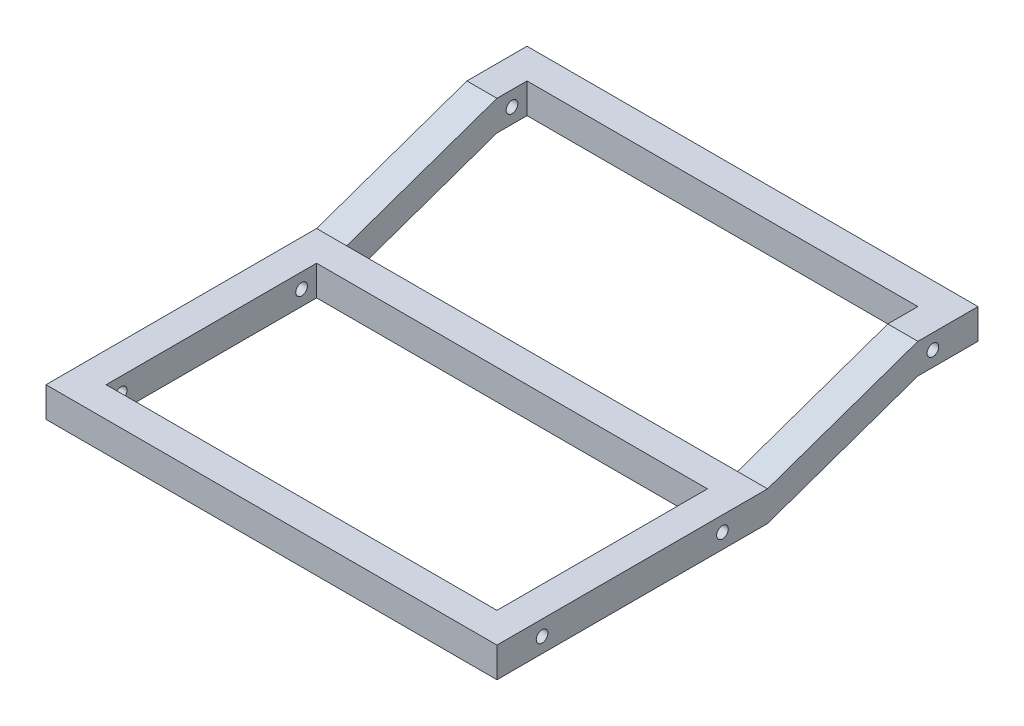
ISO-10303-21;
HEADER;
FILE_DESCRIPTION(('STEP AP214'),'2;1');
FILE_NAME('part.step','',(''),(''),'','','');
FILE_SCHEMA(('AUTOMOTIVE_DESIGN { 1 0 10303 214 1 1 1 1 }'));
ENDSEC;
DATA;
#1=APPLICATION_CONTEXT('core data for automotive mechanical design processes');
#2=APPLICATION_PROTOCOL_DEFINITION('international standard','automotive_design',2000,#1);
#3=PRODUCT_CONTEXT('',#1,'mechanical');
#4=PRODUCT('Part','Part','',(#3));
#5=PRODUCT_RELATED_PRODUCT_CATEGORY('part','',(#4));
#6=PRODUCT_DEFINITION_FORMATION('','',#4);
#7=PRODUCT_DEFINITION_CONTEXT('part definition',#1,'design');
#8=PRODUCT_DEFINITION('design','',#6,#7);
#9=PRODUCT_DEFINITION_SHAPE('','',#8);
#10=(LENGTH_UNIT() NAMED_UNIT(*) SI_UNIT(.MILLI.,.METRE.));
#11=(NAMED_UNIT(*) PLANE_ANGLE_UNIT() SI_UNIT($,.RADIAN.));
#12=(NAMED_UNIT(*) SI_UNIT($,.STERADIAN.) SOLID_ANGLE_UNIT());
#13=UNCERTAINTY_MEASURE_WITH_UNIT(LENGTH_MEASURE(1.E-05),#10,'distance_accuracy_value','');
#14=(GEOMETRIC_REPRESENTATION_CONTEXT(3) GLOBAL_UNCERTAINTY_ASSIGNED_CONTEXT((#13)) GLOBAL_UNIT_ASSIGNED_CONTEXT((#10,
#11,#12)) REPRESENTATION_CONTEXT('',''));
#15=CARTESIAN_POINT('',(0.,0.,0.));
#16=DIRECTION('',(0.,0.,1.));
#17=DIRECTION('',(1.,0.,0.));
#18=AXIS2_PLACEMENT_3D('',#15,#16,#17);
#19=CARTESIAN_POINT('',(0.,8.,-57.2536373614485));
#20=DIRECTION('',(0.,0.,-1.));
#21=DIRECTION('',(-1.,0.,0.));
#22=AXIS2_PLACEMENT_3D('',#19,#20,#21);
#23=PLANE('',#22);
#24=DIRECTION('',(1.,0.,0.));
#25=VECTOR('',#24,1.);
#26=CARTESIAN_POINT('',(0.,8.,-57.2536373614485));
#27=LINE('',#26,#25);
#28=CARTESIAN_POINT('',(-2.55507755048383,8.,-57.2536373614485));
#29=VERTEX_POINT('',#28);
#30=CARTESIAN_POINT('',(101.444922449516,8.,-57.2536373614485));
#31=VERTEX_POINT('',#30);
#32=EDGE_CURVE('E262',#29,#31,#27,.T.);
#33=ORIENTED_EDGE('',*,*,#32,.T.);
#34=DIRECTION('',(0.,1.,0.));
#35=VECTOR('',#34,1.);
#36=CARTESIAN_POINT('',(101.444922449516,0.,-57.2536373614485));
#37=LINE('',#36,#35);
#38=CARTESIAN_POINT('',(101.444922449516,0.,-57.2536373614485));
#39=VERTEX_POINT('',#38);
#40=EDGE_CURVE('E174',#39,#31,#37,.T.);
#41=ORIENTED_EDGE('',*,*,#40,.F.);
#42=DIRECTION('',(1.,0.,0.));
#43=VECTOR('',#42,1.);
#44=CARTESIAN_POINT('',(0.,0.,-57.2536373614485));
#45=LINE('',#44,#43);
#46=CARTESIAN_POINT('',(-2.55507755048383,0.,-57.2536373614485));
#47=VERTEX_POINT('',#46);
#48=EDGE_CURVE('E286',#47,#39,#45,.T.);
#49=ORIENTED_EDGE('',*,*,#48,.F.);
#50=DIRECTION('',(0.,-1.,0.));
#51=VECTOR('',#50,1.);
#52=CARTESIAN_POINT('',(-2.55507755048383,0.,-57.2536373614485));
#53=LINE('',#52,#51);
#54=EDGE_CURVE('E230',#29,#47,#53,.T.);
#55=ORIENTED_EDGE('',*,*,#54,.F.);
#56=EDGE_LOOP('',(#33,#41,#49,#55));
#57=FACE_BOUND('',#56,.T.);
#58=ADVANCED_FACE('F41',(#57),#23,.T.);
#59=CARTESIAN_POINT('',(107.444922449516,22.,-105.253637361449));
#60=DIRECTION('',(0.,0.,-1.));
#61=DIRECTION('',(-1.,0.,0.));
#62=AXIS2_PLACEMENT_3D('',#59,#60,#61);
#63=PLANE('',#62);
#64=DIRECTION('',(0.,-1.,0.));
#65=VECTOR('',#64,1.);
#66=CARTESIAN_POINT('',(101.444922449516,22.,-105.253637361449));
#67=LINE('',#66,#65);
#68=CARTESIAN_POINT('',(101.444922449516,22.,-105.253637361449));
#69=VERTEX_POINT('',#68);
#70=CARTESIAN_POINT('',(101.444922449516,14.,-105.253637361449));
#71=VERTEX_POINT('',#70);
#72=EDGE_CURVE('E11',#69,#71,#67,.T.);
#73=ORIENTED_EDGE('',*,*,#72,.F.);
#74=DIRECTION('',(-1.,0.,0.));
#75=VECTOR('',#74,1.);
#76=CARTESIAN_POINT('',(107.444922449516,22.,-105.253637361449));
#77=LINE('',#76,#75);
#78=CARTESIAN_POINT('',(-2.55507755048387,22.,-105.253637361449));
#79=VERTEX_POINT('',#78);
#80=EDGE_CURVE('E215',#69,#79,#77,.T.);
#81=ORIENTED_EDGE('',*,*,#80,.T.);
#82=DIRECTION('',(0.,-1.,0.));
#83=VECTOR('',#82,1.);
#84=CARTESIAN_POINT('',(-2.55507755048387,22.,-105.253637361449));
#85=LINE('',#84,#83);
#86=CARTESIAN_POINT('',(-2.55507755048387,14.,-105.253637361449));
#87=VERTEX_POINT('',#86);
#88=EDGE_CURVE('E208',#79,#87,#85,.T.);
#89=ORIENTED_EDGE('',*,*,#88,.T.);
#90=DIRECTION('',(-1.,0.,0.));
#91=VECTOR('',#90,1.);
#92=CARTESIAN_POINT('',(107.444922449516,14.,-105.253637361449));
#93=LINE('',#92,#91);
#94=EDGE_CURVE('E61',#71,#87,#93,.T.);
#95=ORIENTED_EDGE('',*,*,#94,.F.);
#96=EDGE_LOOP('',(#73,#81,#89,#95));
#97=FACE_BOUND('',#96,.T.);
#98=ADVANCED_FACE('F385',(#97),#63,.F.);
#99=CARTESIAN_POINT('',(-2.55507755048378,0.,0.));
#100=DIRECTION('',(-1.,0.,0.));
#101=DIRECTION('',(0.,0.,1.));
#102=AXIS2_PLACEMENT_3D('',#99,#100,#101);
#103=PLANE('',#102);
#104=CARTESIAN_POINT('',(-2.55507755048387,18.,-101.253637361449));
#105=DIRECTION('',(-1.,0.,0.));
#106=DIRECTION('',(0.,0.,1.));
#107=AXIS2_PLACEMENT_3D('',#104,#105,#106);
#108=CIRCLE('',#107,1.54999999999999);
#109=CARTESIAN_POINT('',(-2.55507755048387,18.,-99.7036373614485));
#110=VERTEX_POINT('',#109);
#111=EDGE_CURVE('E321',#110,#110,#108,.T.);
#112=ORIENTED_EDGE('',*,*,#111,.T.);
#113=EDGE_LOOP('',(#112));
#114=FACE_BOUND('',#113,.T.);
#115=ORIENTED_EDGE('',*,*,#88,.F.);
#116=DIRECTION('',(0.,0.,-1.));
#117=VECTOR('',#116,1.);
#118=CARTESIAN_POINT('',(-2.55507755048378,22.,0.));
#119=LINE('',#118,#117);
#120=CARTESIAN_POINT('',(-2.55507755048387,22.,-97.2536373614485));
#121=VERTEX_POINT('',#120);
#122=EDGE_CURVE('E221',#121,#79,#119,.T.);
#123=ORIENTED_EDGE('',*,*,#122,.F.);
#124=DIRECTION('',(0.,0.330350424728106,-0.943858356366017));
#125=VECTOR('',#124,1.);
#126=CARTESIAN_POINT('',(-2.55507755048378,-10.7249648788481,-3.75373770759683));
#127=LINE('',#126,#125);
#128=EDGE_CURVE('E218',#29,#121,#127,.T.);
#129=ORIENTED_EDGE('',*,*,#128,.F.);
#130=ORIENTED_EDGE('',*,*,#54,.T.);
#131=DIRECTION('',(0.,0.330350424728106,-0.943858356366017));
#132=VECTOR('',#131,1.);
#133=CARTESIAN_POINT('',(-2.55507755048379,-17.8519136539038,-6.24816977886632));
#134=LINE('',#133,#132);
#135=CARTESIAN_POINT('',(-2.55507755048387,14.,-97.2536373614485));
#136=VERTEX_POINT('',#135);
#137=EDGE_CURVE('E228',#47,#136,#134,.T.);
#138=ORIENTED_EDGE('',*,*,#137,.T.);
#139=DIRECTION('',(0.,0.,-1.));
#140=VECTOR('',#139,1.);
#141=CARTESIAN_POINT('',(-2.55507755048378,14.,0.));
#142=LINE('',#141,#140);
#143=EDGE_CURVE('E225',#136,#87,#142,.T.);
#144=ORIENTED_EDGE('',*,*,#143,.T.);
#145=EDGE_LOOP('',(#115,#123,#129,#130,#138,#144));
#146=FACE_BOUND('',#145,.T.);
#147=ADVANCED_FACE('F381',(#114,#146),#103,.F.);
#148=CARTESIAN_POINT('',(0.,8.,-49.2536373614485));
#149=DIRECTION('',(0.,0.,-1.));
#150=DIRECTION('',(-1.,0.,0.));
#151=AXIS2_PLACEMENT_3D('',#148,#149,#150);
#152=PLANE('',#151);
#153=DIRECTION('',(1.,0.,0.));
#154=VECTOR('',#153,1.);
#155=CARTESIAN_POINT('',(0.,0.,-49.2536373614485));
#156=LINE('',#155,#154);
#157=CARTESIAN_POINT('',(-2.55507755048383,0.,-49.2536373614485));
#158=VERTEX_POINT('',#157);
#159=CARTESIAN_POINT('',(101.444922449516,0.,-49.2536373614485));
#160=VERTEX_POINT('',#159);
#161=EDGE_CURVE('E291',#158,#160,#156,.T.);
#162=ORIENTED_EDGE('',*,*,#161,.T.);
#163=DIRECTION('',(0.,-1.,0.));
#164=VECTOR('',#163,1.);
#165=CARTESIAN_POINT('',(101.444922449516,8.,-49.2536373614485));
#166=LINE('',#165,#164);
#167=CARTESIAN_POINT('',(101.444922449516,8.,-49.2536373614485));
#168=VERTEX_POINT('',#167);
#169=EDGE_CURVE('E50',#168,#160,#166,.T.);
#170=ORIENTED_EDGE('',*,*,#169,.F.);
#171=DIRECTION('',(1.,0.,0.));
#172=VECTOR('',#171,1.);
#173=CARTESIAN_POINT('',(0.,8.,-49.2536373614485));
#174=LINE('',#173,#172);
#175=CARTESIAN_POINT('',(-2.55507755048383,8.,-49.2536373614485));
#176=VERTEX_POINT('',#175);
#177=EDGE_CURVE('E269',#176,#168,#174,.T.);
#178=ORIENTED_EDGE('',*,*,#177,.F.);
#179=DIRECTION('',(0.,-1.,0.));
#180=VECTOR('',#179,1.);
#181=CARTESIAN_POINT('',(-2.55507755048383,8.,-49.2536373614485));
#182=LINE('',#181,#180);
#183=EDGE_CURVE('E302',#176,#158,#182,.T.);
#184=ORIENTED_EDGE('',*,*,#183,.T.);
#185=EDGE_LOOP('',(#162,#170,#178,#184));
#186=FACE_BOUND('',#185,.T.);
#187=ADVANCED_FACE('F362',(#186),#152,.F.);
#188=CARTESIAN_POINT('',(101.444922449516,8.,0.));
#189=DIRECTION('',(1.,0.,0.));
#190=DIRECTION('',(0.,0.,-1.));
#191=AXIS2_PLACEMENT_3D('',#188,#189,#190);
#192=PLANE('',#191);
#193=CARTESIAN_POINT('',(101.444922449516,4.,2.74636263855138));
#194=DIRECTION('',(1.,0.,0.));
#195=DIRECTION('',(0.,0.,-1.));
#196=AXIS2_PLACEMENT_3D('',#193,#194,#195);
#197=CIRCLE('',#196,1.55);
#198=CARTESIAN_POINT('',(101.444922449516,4.,1.19636263855138));
#199=VERTEX_POINT('',#198);
#200=EDGE_CURVE('E192',#199,#199,#197,.T.);
#201=ORIENTED_EDGE('',*,*,#200,.T.);
#202=EDGE_LOOP('',(#201));
#203=FACE_BOUND('',#202,.T.);
#204=CARTESIAN_POINT('',(101.444922449516,4.,-45.2536373614486));
#205=DIRECTION('',(1.,0.,0.));
#206=DIRECTION('',(0.,0.,-1.));
#207=AXIS2_PLACEMENT_3D('',#204,#205,#206);
#208=CIRCLE('',#207,1.55);
#209=CARTESIAN_POINT('',(101.444922449516,4.,-46.8036373614486));
#210=VERTEX_POINT('',#209);
#211=EDGE_CURVE('E325',#210,#210,#208,.T.);
#212=ORIENTED_EDGE('',*,*,#211,.T.);
#213=EDGE_LOOP('',(#212));
#214=FACE_BOUND('',#213,.T.);
#215=DIRECTION('',(0.,0.,1.));
#216=VECTOR('',#215,1.);
#217=CARTESIAN_POINT('',(101.444922449516,0.,0.));
#218=LINE('',#217,#216);
#219=CARTESIAN_POINT('',(101.444922449516,0.,6.74636263855148));
#220=VERTEX_POINT('',#219);
#221=EDGE_CURVE('E294',#160,#220,#218,.T.);
#222=ORIENTED_EDGE('',*,*,#221,.T.);
#223=DIRECTION('',(0.,-1.,0.));
#224=VECTOR('',#223,1.);
#225=CARTESIAN_POINT('',(101.444922449516,8.,6.74636263855148));
#226=LINE('',#225,#224);
#227=CARTESIAN_POINT('',(101.444922449516,8.,6.74636263855148));
#228=VERTEX_POINT('',#227);
#229=EDGE_CURVE('E307',#228,#220,#226,.T.);
#230=ORIENTED_EDGE('',*,*,#229,.F.);
#231=DIRECTION('',(0.,0.,1.));
#232=VECTOR('',#231,1.);
#233=CARTESIAN_POINT('',(101.444922449516,8.,0.));
#234=LINE('',#233,#232);
#235=EDGE_CURVE('E272',#168,#228,#234,.T.);
#236=ORIENTED_EDGE('',*,*,#235,.F.);
#237=ORIENTED_EDGE('',*,*,#169,.T.);
#238=EDGE_LOOP('',(#222,#230,#236,#237));
#239=FACE_BOUND('',#238,.T.);
#240=ADVANCED_FACE('F370',(#203,#214,#239),#192,.F.);
#241=CARTESIAN_POINT('',(0.,8.,6.74636263855148));
#242=DIRECTION('',(0.,0.,-1.));
#243=DIRECTION('',(-1.,0.,0.));
#244=AXIS2_PLACEMENT_3D('',#241,#242,#243);
#245=PLANE('',#244);
#246=DIRECTION('',(1.,0.,0.));
#247=VECTOR('',#246,1.);
#248=CARTESIAN_POINT('',(0.,0.,6.74636263855148));
#249=LINE('',#248,#247);
#250=CARTESIAN_POINT('',(-2.55507755048382,0.,6.74636263855148));
#251=VERTEX_POINT('',#250);
#252=EDGE_CURVE('E297',#251,#220,#249,.T.);
#253=ORIENTED_EDGE('',*,*,#252,.F.);
#254=DIRECTION('',(0.,-1.,0.));
#255=VECTOR('',#254,1.);
#256=CARTESIAN_POINT('',(-2.55507755048382,8.,6.74636263855148));
#257=LINE('',#256,#255);
#258=CARTESIAN_POINT('',(-2.55507755048382,8.,6.74636263855148));
#259=VERTEX_POINT('',#258);
#260=EDGE_CURVE('E304',#259,#251,#257,.T.);
#261=ORIENTED_EDGE('',*,*,#260,.F.);
#262=DIRECTION('',(1.,0.,0.));
#263=VECTOR('',#262,1.);
#264=CARTESIAN_POINT('',(0.,8.,6.74636263855148));
#265=LINE('',#264,#263);
#266=EDGE_CURVE('E274',#259,#228,#265,.T.);
#267=ORIENTED_EDGE('',*,*,#266,.T.);
#268=ORIENTED_EDGE('',*,*,#229,.T.);
#269=EDGE_LOOP('',(#253,#261,#267,#268));
#270=FACE_BOUND('',#269,.T.);
#271=ADVANCED_FACE('F368',(#270),#245,.T.);
#272=CARTESIAN_POINT('',(0.,8.,14.7463626385515));
#273=DIRECTION('',(0.,0.,-1.));
#274=DIRECTION('',(-1.,0.,0.));
#275=AXIS2_PLACEMENT_3D('',#272,#273,#274);
#276=PLANE('',#275);
#277=DIRECTION('',(1.,0.,0.));
#278=VECTOR('',#277,1.);
#279=CARTESIAN_POINT('',(0.,0.,14.7463626385515));
#280=LINE('',#279,#278);
#281=CARTESIAN_POINT('',(-10.5550775504838,0.,14.7463626385515));
#282=VERTEX_POINT('',#281);
#283=CARTESIAN_POINT('',(109.444922449516,0.,14.7463626385515));
#284=VERTEX_POINT('',#283);
#285=EDGE_CURVE('E249',#282,#284,#280,.T.);
#286=ORIENTED_EDGE('',*,*,#285,.T.);
#287=DIRECTION('',(0.,-1.,0.));
#288=VECTOR('',#287,1.);
#289=CARTESIAN_POINT('',(109.444922449516,8.,14.7463626385515));
#290=LINE('',#289,#288);
#291=CARTESIAN_POINT('',(109.444922449516,8.,14.7463626385515));
#292=VERTEX_POINT('',#291);
#293=EDGE_CURVE('E305',#292,#284,#290,.T.);
#294=ORIENTED_EDGE('',*,*,#293,.F.);
#295=DIRECTION('',(1.,0.,0.));
#296=VECTOR('',#295,1.);
#297=CARTESIAN_POINT('',(0.,8.,14.7463626385515));
#298=LINE('',#297,#296);
#299=CARTESIAN_POINT('',(-10.5550775504838,8.,14.7463626385515));
#300=VERTEX_POINT('',#299);
#301=EDGE_CURVE('E255',#300,#292,#298,.T.);
#302=ORIENTED_EDGE('',*,*,#301,.F.);
#303=DIRECTION('',(0.,-1.,0.));
#304=VECTOR('',#303,1.);
#305=CARTESIAN_POINT('',(-10.5550775504838,8.,14.7463626385515));
#306=LINE('',#305,#304);
#307=EDGE_CURVE('E280',#300,#282,#306,.T.);
#308=ORIENTED_EDGE('',*,*,#307,.T.);
#309=EDGE_LOOP('',(#286,#294,#302,#308));
#310=FACE_BOUND('',#309,.T.);
#311=ADVANCED_FACE('F43',(#310),#276,.F.);
#312=CARTESIAN_POINT('',(109.444922449516,8.,1.89856676299637E-13));
#313=DIRECTION('',(-1.,0.,0.));
#314=DIRECTION('',(0.,0.,1.));
#315=AXIS2_PLACEMENT_3D('',#312,#313,#314);
#316=PLANE('',#315);
#317=CARTESIAN_POINT('',(109.444922449516,4.,2.74636263855138));
#318=DIRECTION('',(-1.,0.,0.));
#319=DIRECTION('',(0.,0.,1.));
#320=AXIS2_PLACEMENT_3D('',#317,#318,#319);
#321=CIRCLE('',#320,1.55);
#322=CARTESIAN_POINT('',(109.444922449516,4.,4.29636263855138));
#323=VERTEX_POINT('',#322);
#324=EDGE_CURVE('E336',#323,#323,#321,.T.);
#325=ORIENTED_EDGE('',*,*,#324,.T.);
#326=EDGE_LOOP('',(#325));
#327=FACE_BOUND('',#326,.T.);
#328=CARTESIAN_POINT('',(109.444922449516,4.,-45.2536373614486));
#329=DIRECTION('',(-1.,0.,0.));
#330=DIRECTION('',(0.,0.,1.));
#331=AXIS2_PLACEMENT_3D('',#328,#329,#330);
#332=CIRCLE('',#331,1.55);
#333=CARTESIAN_POINT('',(109.444922449516,4.,-43.7036373614486));
#334=VERTEX_POINT('',#333);
#335=EDGE_CURVE('E320',#334,#334,#332,.T.);
#336=ORIENTED_EDGE('',*,*,#335,.T.);
#337=EDGE_LOOP('',(#336));
#338=FACE_BOUND('',#337,.T.);
#339=CARTESIAN_POINT('',(109.444922449516,18.,-101.253637361449));
#340=DIRECTION('',(-1.,0.,0.));
#341=DIRECTION('',(0.,0.,1.));
#342=AXIS2_PLACEMENT_3D('',#339,#340,#341);
#343=CIRCLE('',#342,1.54999999999999);
#344=CARTESIAN_POINT('',(109.444922449516,18.,-99.7036373614486));
#345=VERTEX_POINT('',#344);
#346=EDGE_CURVE('E316',#345,#345,#343,.T.);
#347=ORIENTED_EDGE('',*,*,#346,.T.);
#348=EDGE_LOOP('',(#347));
#349=FACE_BOUND('',#348,.T.);
#350=DIRECTION('',(0.,0.,-1.));
#351=VECTOR('',#350,1.);
#352=CARTESIAN_POINT('',(109.444922449516,0.,1.89856676299637E-13));
#353=LINE('',#352,#351);
#354=CARTESIAN_POINT('',(109.444922449516,0.,-57.2536373614485));
#355=VERTEX_POINT('',#354);
#356=EDGE_CURVE('E283',#284,#355,#353,.T.);
#357=ORIENTED_EDGE('',*,*,#356,.T.);
#358=DIRECTION('',(0.,0.330350424728106,-0.943858356366018));
#359=VECTOR('',#358,1.);
#360=CARTESIAN_POINT('',(109.444922449516,-17.8519136539037,-6.2481697788663));
#361=LINE('',#360,#359);
#362=CARTESIAN_POINT('',(109.444922449516,14.,-97.2536373614483));
#363=VERTEX_POINT('',#362);
#364=EDGE_CURVE('E199',#355,#363,#361,.T.);
#365=ORIENTED_EDGE('',*,*,#364,.T.);
#366=DIRECTION('',(0.,0.,-1.));
#367=VECTOR('',#366,1.);
#368=CARTESIAN_POINT('',(109.444922449516,14.,0.));
#369=LINE('',#368,#367);
#370=CARTESIAN_POINT('',(109.444922449516,14.,-113.253637361448));
#371=VERTEX_POINT('',#370);
#372=EDGE_CURVE('E169',#363,#371,#369,.T.);
#373=ORIENTED_EDGE('',*,*,#372,.T.);
#374=DIRECTION('',(0.,-1.,0.));
#375=VECTOR('',#374,1.);
#376=CARTESIAN_POINT('',(109.444922449516,0.,-113.253637361448));
#377=LINE('',#376,#375);
#378=CARTESIAN_POINT('',(109.444922449516,22.,-113.253637361448));
#379=VERTEX_POINT('',#378);
#380=EDGE_CURVE('E202',#379,#371,#377,.T.);
#381=ORIENTED_EDGE('',*,*,#380,.F.);
#382=DIRECTION('',(0.,0.,-1.));
#383=VECTOR('',#382,1.);
#384=CARTESIAN_POINT('',(109.444922449516,22.,0.));
#385=LINE('',#384,#383);
#386=CARTESIAN_POINT('',(109.444922449516,22.,-97.2536373614483));
#387=VERTEX_POINT('',#386);
#388=EDGE_CURVE('E189',#387,#379,#385,.T.);
#389=ORIENTED_EDGE('',*,*,#388,.F.);
#390=DIRECTION('',(0.,0.330350424728106,-0.943858356366018));
#391=VECTOR('',#390,1.);
#392=CARTESIAN_POINT('',(109.444922449516,-10.724964878848,-3.75373770759681));
#393=LINE('',#392,#391);
#394=CARTESIAN_POINT('',(109.444922449516,8.,-57.2536373614485));
#395=VERTEX_POINT('',#394);
#396=EDGE_CURVE('E187',#395,#387,#393,.T.);
#397=ORIENTED_EDGE('',*,*,#396,.F.);
#398=DIRECTION('',(0.,0.,-1.));
#399=VECTOR('',#398,1.);
#400=CARTESIAN_POINT('',(109.444922449516,8.,1.89856676299637E-13));
#401=LINE('',#400,#399);
#402=EDGE_CURVE('E258',#292,#395,#401,.T.);
#403=ORIENTED_EDGE('',*,*,#402,.F.);
#404=ORIENTED_EDGE('',*,*,#293,.T.);
#405=EDGE_LOOP('',(#357,#365,#373,#381,#389,#397,#403,#404));
#406=FACE_BOUND('',#405,.T.);
#407=ADVANCED_FACE('F395',(#327,#338,#349,#406),#316,.F.);
#408=CARTESIAN_POINT('',(-10.5550775504838,8.,0.));
#409=DIRECTION('',(-1.,0.,0.));
#410=DIRECTION('',(0.,0.,1.));
#411=AXIS2_PLACEMENT_3D('',#408,#409,#410);
#412=PLANE('',#411);
#413=CARTESIAN_POINT('',(-10.5550775504838,4.,2.74636263855148));
#414=DIRECTION('',(-1.,0.,0.));
#415=DIRECTION('',(0.,0.,1.));
#416=AXIS2_PLACEMENT_3D('',#413,#414,#415);
#417=CIRCLE('',#416,1.55);
#418=CARTESIAN_POINT('',(-10.5550775504838,4.,4.29636263855148));
#419=VERTEX_POINT('',#418);
#420=EDGE_CURVE('E317',#419,#419,#417,.T.);
#421=ORIENTED_EDGE('',*,*,#420,.F.);
#422=EDGE_LOOP('',(#421));
#423=FACE_BOUND('',#422,.T.);
#424=CARTESIAN_POINT('',(-10.5550775504838,4.,-45.2536373614485));
#425=DIRECTION('',(-1.,0.,0.));
#426=DIRECTION('',(0.,0.,1.));
#427=AXIS2_PLACEMENT_3D('',#424,#425,#426);
#428=CIRCLE('',#427,1.55);
#429=CARTESIAN_POINT('',(-10.5550775504838,4.,-43.7036373614485));
#430=VERTEX_POINT('',#429);
#431=EDGE_CURVE('E724',#430,#430,#428,.T.);
#432=ORIENTED_EDGE('',*,*,#431,.F.);
#433=EDGE_LOOP('',(#432));
#434=FACE_BOUND('',#433,.T.);
#435=CARTESIAN_POINT('',(-10.5550775504839,18.,-101.253637361449));
#436=DIRECTION('',(-1.,0.,0.));
#437=DIRECTION('',(0.,0.,1.));
#438=AXIS2_PLACEMENT_3D('',#435,#436,#437);
#439=CIRCLE('',#438,1.54999999999999);
#440=CARTESIAN_POINT('',(-10.5550775504839,18.,-99.7036373614485));
#441=VERTEX_POINT('',#440);
#442=EDGE_CURVE('E726',#441,#441,#439,.T.);
#443=ORIENTED_EDGE('',*,*,#442,.F.);
#444=EDGE_LOOP('',(#443));
#445=FACE_BOUND('',#444,.T.);
#446=DIRECTION('',(0.,0.,-1.));
#447=VECTOR('',#446,1.);
#448=CARTESIAN_POINT('',(-10.5550775504838,0.,0.));
#449=LINE('',#448,#447);
#450=CARTESIAN_POINT('',(-10.5550775504838,0.,-57.2536373614485));
#451=VERTEX_POINT('',#450);
#452=EDGE_CURVE('E289',#282,#451,#449,.T.);
#453=ORIENTED_EDGE('',*,*,#452,.F.);
#454=ORIENTED_EDGE('',*,*,#307,.F.);
#455=DIRECTION('',(0.,0.,-1.));
#456=VECTOR('',#455,1.);
#457=CARTESIAN_POINT('',(-10.5550775504838,8.,0.));
#458=LINE('',#457,#456);
#459=CARTESIAN_POINT('',(-10.5550775504838,8.,-57.2536373614485));
#460=VERTEX_POINT('',#459);
#461=EDGE_CURVE('E266',#300,#460,#458,.T.);
#462=ORIENTED_EDGE('',*,*,#461,.T.);
#463=DIRECTION('',(0.,0.330350424728106,-0.943858356366017));
#464=VECTOR('',#463,1.);
#465=CARTESIAN_POINT('',(-10.5550775504838,-10.7249648788481,-3.75373770759682));
#466=LINE('',#465,#464);
#467=CARTESIAN_POINT('',(-10.5550775504839,22.,-97.2536373614485));
#468=VERTEX_POINT('',#467);
#469=EDGE_CURVE('E217',#460,#468,#466,.T.);
#470=ORIENTED_EDGE('',*,*,#469,.T.);
#471=DIRECTION('',(0.,0.,-1.));
#472=VECTOR('',#471,1.);
#473=CARTESIAN_POINT('',(-10.5550775504838,22.,0.));
#474=LINE('',#473,#472);
#475=CARTESIAN_POINT('',(-10.5550775504839,22.,-113.253637361449));
#476=VERTEX_POINT('',#475);
#477=EDGE_CURVE('E236',#468,#476,#474,.T.);
#478=ORIENTED_EDGE('',*,*,#477,.T.);
#479=DIRECTION('',(0.,1.,0.));
#480=VECTOR('',#479,1.);
#481=CARTESIAN_POINT('',(-10.5550775504839,0.,-113.253637361449));
#482=LINE('',#481,#480);
#483=CARTESIAN_POINT('',(-10.5550775504839,14.,-113.253637361449));
#484=VERTEX_POINT('',#483);
#485=EDGE_CURVE('E239',#484,#476,#482,.T.);
#486=ORIENTED_EDGE('',*,*,#485,.F.);
#487=DIRECTION('',(0.,0.,-1.));
#488=VECTOR('',#487,1.);
#489=CARTESIAN_POINT('',(-10.5550775504838,14.,0.));
#490=LINE('',#489,#488);
#491=CARTESIAN_POINT('',(-10.5550775504839,14.,-97.2536373614485));
#492=VERTEX_POINT('',#491);
#493=EDGE_CURVE('E242',#492,#484,#490,.T.);
#494=ORIENTED_EDGE('',*,*,#493,.F.);
#495=DIRECTION('',(0.,0.330350424728106,-0.943858356366017));
#496=VECTOR('',#495,1.);
#497=CARTESIAN_POINT('',(-10.5550775504838,-17.8519136539038,-6.24816977886631));
#498=LINE('',#497,#496);
#499=EDGE_CURVE('E222',#451,#492,#498,.T.);
#500=ORIENTED_EDGE('',*,*,#499,.F.);
#501=EDGE_LOOP('',(#453,#454,#462,#470,#478,#486,#494,#500));
#502=FACE_BOUND('',#501,.T.);
#503=ADVANCED_FACE('F351',(#423,#434,#445,#502),#412,.T.);
#504=CARTESIAN_POINT('',(-2.55507755048382,8.,0.));
#505=DIRECTION('',(1.,0.,0.));
#506=DIRECTION('',(0.,0.,-1.));
#507=AXIS2_PLACEMENT_3D('',#504,#505,#506);
#508=PLANE('',#507);
#509=CARTESIAN_POINT('',(-2.55507755048381,4.,2.74636263855147));
#510=DIRECTION('',(1.,0.,0.));
#511=DIRECTION('',(0.,0.,-1.));
#512=AXIS2_PLACEMENT_3D('',#509,#510,#511);
#513=CIRCLE('',#512,1.55);
#514=CARTESIAN_POINT('',(-2.55507755048381,4.,1.19636263855147));
#515=VERTEX_POINT('',#514);
#516=EDGE_CURVE('E45',#515,#515,#513,.T.);
#517=ORIENTED_EDGE('',*,*,#516,.F.);
#518=EDGE_LOOP('',(#517));
#519=FACE_BOUND('',#518,.T.);
#520=CARTESIAN_POINT('',(-2.55507755048381,4.,-45.2536373614485));
#521=DIRECTION('',(1.,0.,0.));
#522=DIRECTION('',(0.,0.,-1.));
#523=AXIS2_PLACEMENT_3D('',#520,#521,#522);
#524=CIRCLE('',#523,1.55);
#525=CARTESIAN_POINT('',(-2.55507755048381,4.,-46.8036373614485));
#526=VERTEX_POINT('',#525);
#527=EDGE_CURVE('E318',#526,#526,#524,.T.);
#528=ORIENTED_EDGE('',*,*,#527,.F.);
#529=EDGE_LOOP('',(#528));
#530=FACE_BOUND('',#529,.T.);
#531=DIRECTION('',(0.,0.,1.));
#532=VECTOR('',#531,1.);
#533=CARTESIAN_POINT('',(-2.55507755048382,0.,0.));
#534=LINE('',#533,#532);
#535=EDGE_CURVE('E259',#158,#251,#534,.T.);
#536=ORIENTED_EDGE('',*,*,#535,.F.);
#537=ORIENTED_EDGE('',*,*,#183,.F.);
#538=DIRECTION('',(0.,0.,1.));
#539=VECTOR('',#538,1.);
#540=CARTESIAN_POINT('',(-2.55507755048382,8.,0.));
#541=LINE('',#540,#539);
#542=EDGE_CURVE('E277',#176,#259,#541,.T.);
#543=ORIENTED_EDGE('',*,*,#542,.T.);
#544=ORIENTED_EDGE('',*,*,#260,.T.);
#545=EDGE_LOOP('',(#536,#537,#543,#544));
#546=FACE_BOUND('',#545,.T.);
#547=ADVANCED_FACE('F347',(#519,#530,#546),#508,.T.);
#548=CARTESIAN_POINT('',(0.,8.,0.));
#549=DIRECTION('',(0.,1.,0.));
#550=DIRECTION('',(0.,0.,1.));
#551=AXIS2_PLACEMENT_3D('',#548,#549,#550);
#552=PLANE('',#551);
#553=ORIENTED_EDGE('',*,*,#301,.T.);
#554=ORIENTED_EDGE('',*,*,#402,.T.);
#555=DIRECTION('',(1.,0.,0.));
#556=VECTOR('',#555,1.);
#557=CARTESIAN_POINT('',(101.444922449516,8.,-57.2536373614485));
#558=LINE('',#557,#556);
#559=EDGE_CURVE('E209',#31,#395,#558,.T.);
#560=ORIENTED_EDGE('',*,*,#559,.F.);
#561=ORIENTED_EDGE('',*,*,#32,.F.);
#562=EDGE_CURVE('E263',#460,#29,#27,.T.);
#563=ORIENTED_EDGE('',*,*,#562,.F.);
#564=ORIENTED_EDGE('',*,*,#461,.F.);
#565=EDGE_LOOP('',(#553,#554,#560,#561,#563,#564));
#566=FACE_BOUND('',#565,.T.);
#567=ORIENTED_EDGE('',*,*,#177,.T.);
#568=ORIENTED_EDGE('',*,*,#235,.T.);
#569=ORIENTED_EDGE('',*,*,#266,.F.);
#570=ORIENTED_EDGE('',*,*,#542,.F.);
#571=EDGE_LOOP('',(#567,#568,#569,#570));
#572=FACE_BOUND('',#571,.T.);
#573=ADVANCED_FACE('F350',(#566,#572),#552,.T.);
#574=CARTESIAN_POINT('',(0.,0.,0.));
#575=DIRECTION('',(0.,1.,0.));
#576=DIRECTION('',(0.,0.,1.));
#577=AXIS2_PLACEMENT_3D('',#574,#575,#576);
#578=PLANE('',#577);
#579=ORIENTED_EDGE('',*,*,#285,.F.);
#580=ORIENTED_EDGE('',*,*,#452,.T.);
#581=EDGE_CURVE('E287',#451,#47,#45,.T.);
#582=ORIENTED_EDGE('',*,*,#581,.T.);
#583=ORIENTED_EDGE('',*,*,#48,.T.);
#584=DIRECTION('',(1.,0.,0.));
#585=VECTOR('',#584,1.);
#586=CARTESIAN_POINT('',(101.444922449516,0.,-57.2536373614485));
#587=LINE('',#586,#585);
#588=EDGE_CURVE('E186',#39,#355,#587,.T.);
#589=ORIENTED_EDGE('',*,*,#588,.T.);
#590=ORIENTED_EDGE('',*,*,#356,.F.);
#591=EDGE_LOOP('',(#579,#580,#582,#583,#589,#590));
#592=FACE_BOUND('',#591,.T.);
#593=ORIENTED_EDGE('',*,*,#161,.F.);
#594=ORIENTED_EDGE('',*,*,#535,.T.);
#595=ORIENTED_EDGE('',*,*,#252,.T.);
#596=ORIENTED_EDGE('',*,*,#221,.F.);
#597=EDGE_LOOP('',(#593,#594,#595,#596));
#598=FACE_BOUND('',#597,.T.);
#599=ADVANCED_FACE('F359',(#592,#598),#578,.F.);
#600=CARTESIAN_POINT('',(-2.55507755048378,-10.7249648788481,-3.75373770759683));
#601=DIRECTION('',(0.,0.943858356366017,0.330350424728106));
#602=DIRECTION('',(0.,-0.330350424728106,0.943858356366017));
#603=AXIS2_PLACEMENT_3D('',#600,#601,#602);
#604=PLANE('',#603);
#605=ORIENTED_EDGE('',*,*,#469,.F.);
#606=ORIENTED_EDGE('',*,*,#562,.T.);
#607=ORIENTED_EDGE('',*,*,#128,.T.);
#608=DIRECTION('',(-1.,0.,0.));
#609=VECTOR('',#608,1.);
#610=CARTESIAN_POINT('',(-2.55507755048387,22.,-97.2536373614485));
#611=LINE('',#610,#609);
#612=EDGE_CURVE('E233',#121,#468,#611,.T.);
#613=ORIENTED_EDGE('',*,*,#612,.T.);
#614=EDGE_LOOP('',(#605,#606,#607,#613));
#615=FACE_BOUND('',#614,.T.);
#616=ADVANCED_FACE('F445',(#615),#604,.T.);
#617=CARTESIAN_POINT('',(-2.55507755048379,-17.8519136539038,-6.24816977886632));
#618=DIRECTION('',(0.,0.943858356366017,0.330350424728106));
#619=DIRECTION('',(0.,-0.330350424728106,0.943858356366017));
#620=AXIS2_PLACEMENT_3D('',#617,#618,#619);
#621=PLANE('',#620);
#622=ORIENTED_EDGE('',*,*,#499,.T.);
#623=DIRECTION('',(-1.,0.,0.));
#624=VECTOR('',#623,1.);
#625=CARTESIAN_POINT('',(-2.55507755048387,14.,-97.2536373614485));
#626=LINE('',#625,#624);
#627=EDGE_CURVE('E246',#136,#492,#626,.T.);
#628=ORIENTED_EDGE('',*,*,#627,.F.);
#629=ORIENTED_EDGE('',*,*,#137,.F.);
#630=ORIENTED_EDGE('',*,*,#581,.F.);
#631=EDGE_LOOP('',(#622,#628,#629,#630));
#632=FACE_BOUND('',#631,.T.);
#633=ADVANCED_FACE('F422',(#632),#621,.F.);
#634=CARTESIAN_POINT('',(-2.55507755048378,14.,0.));
#635=DIRECTION('',(0.,1.,0.));
#636=DIRECTION('',(0.,0.,1.));
#637=AXIS2_PLACEMENT_3D('',#634,#635,#636);
#638=PLANE('',#637);
#639=DIRECTION('',(0.,0.,-1.));
#640=VECTOR('',#639,1.);
#641=CARTESIAN_POINT('',(101.444922449516,14.,0.));
#642=LINE('',#641,#640);
#643=CARTESIAN_POINT('',(101.444922449516,14.,-97.2536373614483));
#644=VERTEX_POINT('',#643);
#645=EDGE_CURVE('E167',#644,#71,#642,.T.);
#646=ORIENTED_EDGE('',*,*,#645,.T.);
#647=ORIENTED_EDGE('',*,*,#94,.T.);
#648=ORIENTED_EDGE('',*,*,#143,.F.);
#649=ORIENTED_EDGE('',*,*,#627,.T.);
#650=ORIENTED_EDGE('',*,*,#493,.T.);
#651=DIRECTION('',(-1.,0.,0.));
#652=VECTOR('',#651,1.);
#653=CARTESIAN_POINT('',(-2.55507755048388,14.,-113.253637361449));
#654=LINE('',#653,#652);
#655=EDGE_CURVE('E250',#371,#484,#654,.T.);
#656=ORIENTED_EDGE('',*,*,#655,.F.);
#657=ORIENTED_EDGE('',*,*,#372,.F.);
#658=DIRECTION('',(1.,0.,0.));
#659=VECTOR('',#658,1.);
#660=CARTESIAN_POINT('',(101.444922449516,14.,-97.2536373614483));
#661=LINE('',#660,#659);
#662=EDGE_CURVE('E164',#644,#363,#661,.T.);
#663=ORIENTED_EDGE('',*,*,#662,.F.);
#664=EDGE_LOOP('',(#646,#647,#648,#649,#650,#656,#657,#663));
#665=FACE_BOUND('',#664,.T.);
#666=ADVANCED_FACE('F166',(#665),#638,.F.);
#667=CARTESIAN_POINT('',(-2.55507755048388,0.,-113.253637361449));
#668=DIRECTION('',(0.,0.,1.));
#669=DIRECTION('',(1.,0.,0.));
#670=AXIS2_PLACEMENT_3D('',#667,#668,#669);
#671=PLANE('',#670);
#672=ORIENTED_EDGE('',*,*,#655,.T.);
#673=ORIENTED_EDGE('',*,*,#485,.T.);
#674=DIRECTION('',(-1.,0.,0.));
#675=VECTOR('',#674,1.);
#676=CARTESIAN_POINT('',(-2.55507755048388,22.,-113.253637361449));
#677=LINE('',#676,#675);
#678=EDGE_CURVE('E252',#379,#476,#677,.T.);
#679=ORIENTED_EDGE('',*,*,#678,.F.);
#680=ORIENTED_EDGE('',*,*,#380,.T.);
#681=EDGE_LOOP('',(#672,#673,#679,#680));
#682=FACE_BOUND('',#681,.T.);
#683=ADVANCED_FACE('F438',(#682),#671,.F.);
#684=CARTESIAN_POINT('',(-2.55507755048378,22.,0.));
#685=DIRECTION('',(0.,1.,0.));
#686=DIRECTION('',(0.,0.,1.));
#687=AXIS2_PLACEMENT_3D('',#684,#685,#686);
#688=PLANE('',#687);
#689=ORIENTED_EDGE('',*,*,#678,.T.);
#690=ORIENTED_EDGE('',*,*,#477,.F.);
#691=ORIENTED_EDGE('',*,*,#612,.F.);
#692=ORIENTED_EDGE('',*,*,#122,.T.);
#693=ORIENTED_EDGE('',*,*,#80,.F.);
#694=DIRECTION('',(0.,0.,-1.));
#695=VECTOR('',#694,1.);
#696=CARTESIAN_POINT('',(101.444922449516,22.,0.));
#697=LINE('',#696,#695);
#698=CARTESIAN_POINT('',(101.444922449516,22.,-97.2536373614483));
#699=VERTEX_POINT('',#698);
#700=EDGE_CURVE('E182',#699,#69,#697,.T.);
#701=ORIENTED_EDGE('',*,*,#700,.F.);
#702=DIRECTION('',(1.,0.,0.));
#703=VECTOR('',#702,1.);
#704=CARTESIAN_POINT('',(101.444922449516,22.,-97.2536373614483));
#705=LINE('',#704,#703);
#706=EDGE_CURVE('E173',#699,#387,#705,.T.);
#707=ORIENTED_EDGE('',*,*,#706,.T.);
#708=ORIENTED_EDGE('',*,*,#388,.T.);
#709=EDGE_LOOP('',(#689,#690,#691,#692,#693,#701,#707,#708));
#710=FACE_BOUND('',#709,.T.);
#711=ADVANCED_FACE('F428',(#710),#688,.T.);
#712=CARTESIAN_POINT('',(101.444922449516,0.,0.));
#713=DIRECTION('',(1.,0.,0.));
#714=DIRECTION('',(0.,0.,-1.));
#715=AXIS2_PLACEMENT_3D('',#712,#713,#714);
#716=PLANE('',#715);
#717=CARTESIAN_POINT('',(101.444922449516,18.,-101.253637361449));
#718=DIRECTION('',(1.,0.,0.));
#719=DIRECTION('',(0.,0.,-1.));
#720=AXIS2_PLACEMENT_3D('',#717,#718,#719);
#721=CIRCLE('',#720,1.54999999999999);
#722=CARTESIAN_POINT('',(101.444922449516,18.,-102.803637361449));
#723=VERTEX_POINT('',#722);
#724=EDGE_CURVE('E314',#723,#723,#721,.T.);
#725=ORIENTED_EDGE('',*,*,#724,.T.);
#726=EDGE_LOOP('',(#725));
#727=FACE_BOUND('',#726,.T.);
#728=ORIENTED_EDGE('',*,*,#700,.T.);
#729=ORIENTED_EDGE('',*,*,#72,.T.);
#730=ORIENTED_EDGE('',*,*,#645,.F.);
#731=DIRECTION('',(0.,0.330350424728106,-0.943858356366018));
#732=VECTOR('',#731,1.);
#733=CARTESIAN_POINT('',(101.444922449516,-17.8519136539037,-6.2481697788663));
#734=LINE('',#733,#732);
#735=EDGE_CURVE('E180',#39,#644,#734,.T.);
#736=ORIENTED_EDGE('',*,*,#735,.F.);
#737=ORIENTED_EDGE('',*,*,#40,.T.);
#738=DIRECTION('',(0.,0.330350424728106,-0.943858356366018));
#739=VECTOR('',#738,1.);
#740=CARTESIAN_POINT('',(101.444922449516,-10.724964878848,-3.75373770759681));
#741=LINE('',#740,#739);
#742=EDGE_CURVE('E196',#31,#699,#741,.T.);
#743=ORIENTED_EDGE('',*,*,#742,.T.);
#744=EDGE_LOOP('',(#728,#729,#730,#736,#737,#743));
#745=FACE_BOUND('',#744,.T.);
#746=ADVANCED_FACE('F179',(#727,#745),#716,.F.);
#747=CARTESIAN_POINT('',(101.444922449516,-17.8519136539037,-6.2481697788663));
#748=DIRECTION('',(0.,-0.943858356366017,-0.330350424728106));
#749=DIRECTION('',(0.,0.330350424728106,-0.943858356366018));
#750=AXIS2_PLACEMENT_3D('',#747,#748,#749);
#751=PLANE('',#750);
#752=ORIENTED_EDGE('',*,*,#364,.F.);
#753=ORIENTED_EDGE('',*,*,#588,.F.);
#754=ORIENTED_EDGE('',*,*,#735,.T.);
#755=ORIENTED_EDGE('',*,*,#662,.T.);
#756=EDGE_LOOP('',(#752,#753,#754,#755));
#757=FACE_BOUND('',#756,.T.);
#758=ADVANCED_FACE('F184',(#757),#751,.T.);
#759=CARTESIAN_POINT('',(101.444922449516,-10.724964878848,-3.75373770759681));
#760=DIRECTION('',(0.,-0.943858356366017,-0.330350424728106));
#761=DIRECTION('',(0.,0.330350424728106,-0.943858356366018));
#762=AXIS2_PLACEMENT_3D('',#759,#760,#761);
#763=PLANE('',#762);
#764=ORIENTED_EDGE('',*,*,#396,.T.);
#765=ORIENTED_EDGE('',*,*,#706,.F.);
#766=ORIENTED_EDGE('',*,*,#742,.F.);
#767=ORIENTED_EDGE('',*,*,#559,.T.);
#768=EDGE_LOOP('',(#764,#765,#766,#767));
#769=FACE_BOUND('',#768,.T.);
#770=ADVANCED_FACE('F433',(#769),#763,.F.);
#771=CARTESIAN_POINT('',(200.444922449516,18.,-101.253637361449));
#772=DIRECTION('',(-1.,0.,0.));
#773=DIRECTION('',(0.,0.,1.));
#774=AXIS2_PLACEMENT_3D('',#771,#772,#773);
#775=CYLINDRICAL_SURFACE('',#774,1.54999999999999);
#776=ORIENTED_EDGE('',*,*,#724,.F.);
#777=EDGE_LOOP('',(#776));
#778=FACE_BOUND('',#777,.T.);
#779=ORIENTED_EDGE('',*,*,#346,.F.);
#780=EDGE_LOOP('',(#779));
#781=FACE_BOUND('',#780,.T.);
#782=ADVANCED_FACE('F469',(#778,#781),#775,.F.);
#783=CARTESIAN_POINT('',(200.444922449516,4.,-45.2536373614487));
#784=DIRECTION('',(-1.,0.,0.));
#785=DIRECTION('',(0.,0.,1.));
#786=AXIS2_PLACEMENT_3D('',#783,#784,#785);
#787=CYLINDRICAL_SURFACE('',#786,1.55);
#788=ORIENTED_EDGE('',*,*,#527,.T.);
#789=EDGE_LOOP('',(#788));
#790=FACE_BOUND('',#789,.T.);
#791=ORIENTED_EDGE('',*,*,#431,.T.);
#792=EDGE_LOOP('',(#791));
#793=FACE_BOUND('',#792,.T.);
#794=ADVANCED_FACE('F478',(#790,#793),#787,.F.);
#795=CARTESIAN_POINT('',(200.444922449516,4.,2.7463626385513));
#796=DIRECTION('',(-1.,0.,0.));
#797=DIRECTION('',(0.,0.,1.));
#798=AXIS2_PLACEMENT_3D('',#795,#796,#797);
#799=CYLINDRICAL_SURFACE('',#798,1.55);
#800=ORIENTED_EDGE('',*,*,#516,.T.);
#801=EDGE_LOOP('',(#800));
#802=FACE_BOUND('',#801,.T.);
#803=ORIENTED_EDGE('',*,*,#420,.T.);
#804=EDGE_LOOP('',(#803));
#805=FACE_BOUND('',#804,.T.);
#806=ADVANCED_FACE('F344',(#802,#805),#799,.F.);
#807=ORIENTED_EDGE('',*,*,#442,.T.);
#808=EDGE_LOOP('',(#807));
#809=FACE_BOUND('',#808,.T.);
#810=ORIENTED_EDGE('',*,*,#111,.F.);
#811=EDGE_LOOP('',(#810));
#812=FACE_BOUND('',#811,.T.);
#813=ADVANCED_FACE('F473',(#809,#812),#775,.F.);
#814=ORIENTED_EDGE('',*,*,#335,.F.);
#815=EDGE_LOOP('',(#814));
#816=FACE_BOUND('',#815,.T.);
#817=ORIENTED_EDGE('',*,*,#211,.F.);
#818=EDGE_LOOP('',(#817));
#819=FACE_BOUND('',#818,.T.);
#820=ADVANCED_FACE('F476',(#816,#819),#787,.F.);
#821=ORIENTED_EDGE('',*,*,#324,.F.);
#822=EDGE_LOOP('',(#821));
#823=FACE_BOUND('',#822,.T.);
#824=ORIENTED_EDGE('',*,*,#200,.F.);
#825=EDGE_LOOP('',(#824));
#826=FACE_BOUND('',#825,.T.);
#827=ADVANCED_FACE('F482',(#823,#826),#799,.F.);
#828=CLOSED_SHELL('',(#58,#98,#147,#187,#240,#271,#311,#407,#503,#547,#573,#599,#616,#633,#666,
#683,#711,#746,#758,#770,#782,#794,#806,#813,#820,#827));
#829=MANIFOLD_SOLID_BREP('B2',#828);
#830=ADVANCED_BREP_SHAPE_REPRESENTATION('',(#18,#829),#14);
#831=SHAPE_DEFINITION_REPRESENTATION(#9,#830);
ENDSEC;
END-ISO-10303-21;
